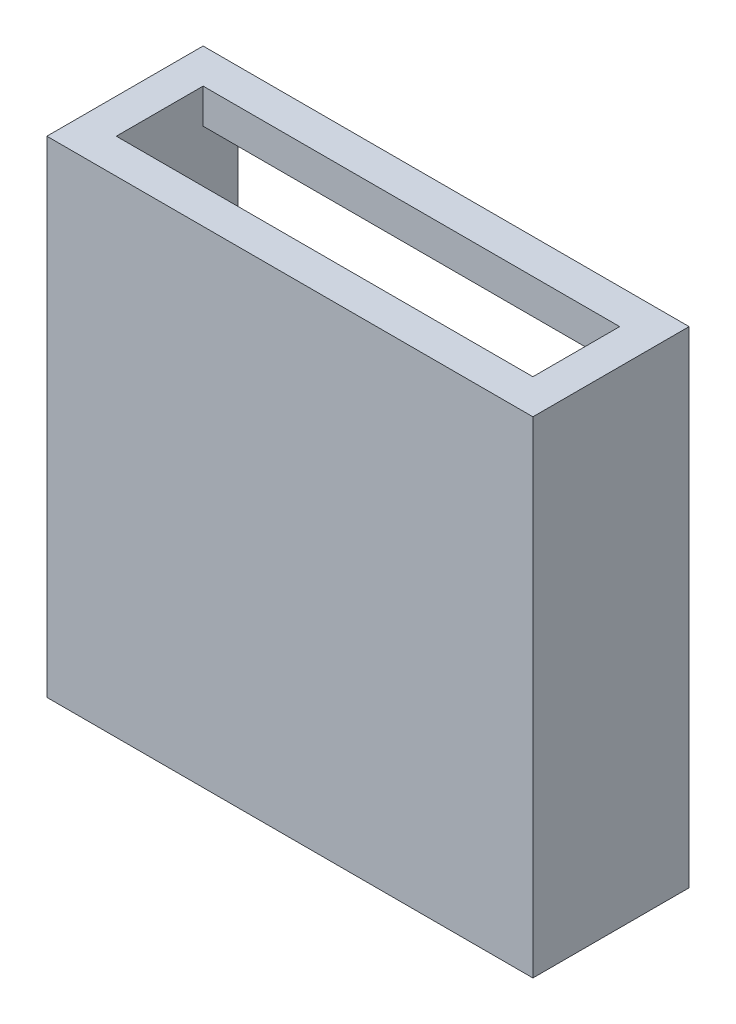
ISO-10303-21;
HEADER;
FILE_DESCRIPTION(('STEP AP214'),'2;1');
FILE_NAME('part.step','',(''),(''),'','','');
FILE_SCHEMA(('AUTOMOTIVE_DESIGN { 1 0 10303 214 1 1 1 1 }'));
ENDSEC;
DATA;
#1=APPLICATION_CONTEXT('core data for automotive mechanical design processes');
#2=APPLICATION_PROTOCOL_DEFINITION('international standard','automotive_design',2000,#1);
#3=PRODUCT_CONTEXT('',#1,'mechanical');
#4=PRODUCT('Part','Part','',(#3));
#5=PRODUCT_RELATED_PRODUCT_CATEGORY('part','',(#4));
#6=PRODUCT_DEFINITION_FORMATION('','',#4);
#7=PRODUCT_DEFINITION_CONTEXT('part definition',#1,'design');
#8=PRODUCT_DEFINITION('design','',#6,#7);
#9=PRODUCT_DEFINITION_SHAPE('','',#8);
#10=(LENGTH_UNIT() NAMED_UNIT(*) SI_UNIT(.MILLI.,.METRE.));
#11=(NAMED_UNIT(*) PLANE_ANGLE_UNIT() SI_UNIT($,.RADIAN.));
#12=(NAMED_UNIT(*) SI_UNIT($,.STERADIAN.) SOLID_ANGLE_UNIT());
#13=UNCERTAINTY_MEASURE_WITH_UNIT(LENGTH_MEASURE(1.E-05),#10,'distance_accuracy_value','');
#14=(GEOMETRIC_REPRESENTATION_CONTEXT(3) GLOBAL_UNCERTAINTY_ASSIGNED_CONTEXT((#13)) GLOBAL_UNIT_ASSIGNED_CONTEXT((#10,
#11,#12)) REPRESENTATION_CONTEXT('',''));
#15=CARTESIAN_POINT('',(0.,0.,0.));
#16=DIRECTION('',(0.,0.,1.));
#17=DIRECTION('',(1.,0.,0.));
#18=AXIS2_PLACEMENT_3D('',#15,#16,#17);
#19=CARTESIAN_POINT('',(12.,-12.,-7.));
#20=DIRECTION('',(-1.,0.,0.));
#21=DIRECTION('',(0.,-1.,0.));
#22=AXIS2_PLACEMENT_3D('',#19,#20,#21);
#23=PLANE('',#22);
#24=DIRECTION('',(0.,0.,1.));
#25=VECTOR('',#24,1.);
#26=CARTESIAN_POINT('',(12.,-12.,-7.));
#27=LINE('',#26,#25);
#28=CARTESIAN_POINT('',(12.,-12.,-7.));
#29=VERTEX_POINT('',#28);
#30=CARTESIAN_POINT('',(12.,-12.,-5.));
#31=VERTEX_POINT('',#30);
#32=EDGE_CURVE('E384',#29,#31,#27,.T.);
#33=ORIENTED_EDGE('',*,*,#32,.T.);
#34=DIRECTION('',(0.,1.,0.));
#35=VECTOR('',#34,1.);
#36=CARTESIAN_POINT('',(12.,-14.,-5.));
#37=LINE('',#36,#35);
#38=CARTESIAN_POINT('',(12.,-14.,-5.));
#39=VERTEX_POINT('',#38);
#40=EDGE_CURVE('E365',#39,#31,#37,.T.);
#41=ORIENTED_EDGE('',*,*,#40,.F.);
#42=DIRECTION('',(0.,0.,-1.));
#43=VECTOR('',#42,1.);
#44=CARTESIAN_POINT('',(12.,-14.,0.));
#45=LINE('',#44,#43);
#46=CARTESIAN_POINT('',(12.,-14.,0.));
#47=VERTEX_POINT('',#46);
#48=EDGE_CURVE('E343',#47,#39,#45,.T.);
#49=ORIENTED_EDGE('',*,*,#48,.F.);
#50=DIRECTION('',(0.,-1.,0.));
#51=VECTOR('',#50,1.);
#52=CARTESIAN_POINT('',(12.,-12.,0.));
#53=LINE('',#52,#51);
#54=CARTESIAN_POINT('',(12.,14.,0.));
#55=VERTEX_POINT('',#54);
#56=EDGE_CURVE('E372',#55,#47,#53,.T.);
#57=ORIENTED_EDGE('',*,*,#56,.F.);
#58=DIRECTION('',(0.,0.,-1.));
#59=VECTOR('',#58,1.);
#60=CARTESIAN_POINT('',(12.,14.,0.));
#61=LINE('',#60,#59);
#62=CARTESIAN_POINT('',(12.,14.,-5.));
#63=VERTEX_POINT('',#62);
#64=EDGE_CURVE('E355',#55,#63,#61,.T.);
#65=ORIENTED_EDGE('',*,*,#64,.T.);
#66=CARTESIAN_POINT('',(12.,12.,-5.));
#67=VERTEX_POINT('',#66);
#68=EDGE_CURVE('E349',#67,#63,#37,.T.);
#69=ORIENTED_EDGE('',*,*,#68,.F.);
#70=DIRECTION('',(0.,0.,1.));
#71=VECTOR('',#70,1.);
#72=CARTESIAN_POINT('',(12.,12.,-7.));
#73=LINE('',#72,#71);
#74=CARTESIAN_POINT('',(12.,12.,-7.));
#75=VERTEX_POINT('',#74);
#76=EDGE_CURVE('E387',#75,#67,#73,.T.);
#77=ORIENTED_EDGE('',*,*,#76,.F.);
#78=DIRECTION('',(0.,-1.,0.));
#79=VECTOR('',#78,1.);
#80=CARTESIAN_POINT('',(12.,-12.,-7.));
#81=LINE('',#80,#79);
#82=EDGE_CURVE('E374',#75,#29,#81,.T.);
#83=ORIENTED_EDGE('',*,*,#82,.T.);
#84=EDGE_LOOP('',(#33,#41,#49,#57,#65,#69,#77,#83));
#85=FACE_BOUND('',#84,.T.);
#86=DIRECTION('',(0.,1.,0.));
#87=VECTOR('',#86,1.);
#88=CARTESIAN_POINT('',(12.,-4.,-4.));
#89=LINE('',#88,#87);
#90=CARTESIAN_POINT('',(12.,-4.,-4.));
#91=VERTEX_POINT('',#90);
#92=CARTESIAN_POINT('',(12.,4.,-4.));
#93=VERTEX_POINT('',#92);
#94=EDGE_CURVE('E53',#91,#93,#89,.T.);
#95=ORIENTED_EDGE('',*,*,#94,.F.);
#96=DIRECTION('',(0.,0.,1.));
#97=VECTOR('',#96,1.);
#98=CARTESIAN_POINT('',(12.,-4.,-4.));
#99=LINE('',#98,#97);
#100=CARTESIAN_POINT('',(12.,-4.,-6.));
#101=VERTEX_POINT('',#100);
#102=EDGE_CURVE('E58',#101,#91,#99,.T.);
#103=ORIENTED_EDGE('',*,*,#102,.F.);
#104=DIRECTION('',(0.,1.,0.));
#105=VECTOR('',#104,1.);
#106=CARTESIAN_POINT('',(12.,-4.,-6.));
#107=LINE('',#106,#105);
#108=CARTESIAN_POINT('',(12.,4.,-6.));
#109=VERTEX_POINT('',#108);
#110=EDGE_CURVE('E213',#101,#109,#107,.T.);
#111=ORIENTED_EDGE('',*,*,#110,.T.);
#112=DIRECTION('',(0.,0.,1.));
#113=VECTOR('',#112,1.);
#114=CARTESIAN_POINT('',(12.,4.,-4.));
#115=LINE('',#114,#113);
#116=EDGE_CURVE('E215',#109,#93,#115,.T.);
#117=ORIENTED_EDGE('',*,*,#116,.T.);
#118=EDGE_LOOP('',(#95,#103,#111,#117));
#119=FACE_BOUND('',#118,.T.);
#120=ADVANCED_FACE('F38',(#85,#119),#23,.T.);
#121=CARTESIAN_POINT('',(-12.,-12.,-7.));
#122=DIRECTION('',(1.,0.,0.));
#123=DIRECTION('',(0.,0.,-1.));
#124=AXIS2_PLACEMENT_3D('',#121,#122,#123);
#125=PLANE('',#124);
#126=DIRECTION('',(0.,0.,1.));
#127=VECTOR('',#126,1.);
#128=CARTESIAN_POINT('',(-12.,12.,-7.));
#129=LINE('',#128,#127);
#130=CARTESIAN_POINT('',(-12.,12.,-7.));
#131=VERTEX_POINT('',#130);
#132=CARTESIAN_POINT('',(-12.,12.,-5.));
#133=VERTEX_POINT('',#132);
#134=EDGE_CURVE('E390',#131,#133,#129,.T.);
#135=ORIENTED_EDGE('',*,*,#134,.T.);
#136=DIRECTION('',(0.,1.,0.));
#137=VECTOR('',#136,1.);
#138=CARTESIAN_POINT('',(-12.,-14.,-5.));
#139=LINE('',#138,#137);
#140=CARTESIAN_POINT('',(-12.,14.,-5.));
#141=VERTEX_POINT('',#140);
#142=EDGE_CURVE('E364',#133,#141,#139,.T.);
#143=ORIENTED_EDGE('',*,*,#142,.T.);
#144=DIRECTION('',(0.,0.,1.));
#145=VECTOR('',#144,1.);
#146=CARTESIAN_POINT('',(-12.,14.,0.));
#147=LINE('',#146,#145);
#148=CARTESIAN_POINT('',(-12.,14.,0.));
#149=VERTEX_POINT('',#148);
#150=EDGE_CURVE('E335',#141,#149,#147,.T.);
#151=ORIENTED_EDGE('',*,*,#150,.T.);
#152=DIRECTION('',(0.,1.,0.));
#153=VECTOR('',#152,1.);
#154=CARTESIAN_POINT('',(-12.,-12.,0.));
#155=LINE('',#154,#153);
#156=CARTESIAN_POINT('',(-12.,-14.,0.));
#157=VERTEX_POINT('',#156);
#158=EDGE_CURVE('E368',#157,#149,#155,.T.);
#159=ORIENTED_EDGE('',*,*,#158,.F.);
#160=DIRECTION('',(0.,0.,1.));
#161=VECTOR('',#160,1.);
#162=CARTESIAN_POINT('',(-12.,-14.,0.));
#163=LINE('',#162,#161);
#164=CARTESIAN_POINT('',(-12.,-14.,-5.));
#165=VERTEX_POINT('',#164);
#166=EDGE_CURVE('E336',#165,#157,#163,.T.);
#167=ORIENTED_EDGE('',*,*,#166,.F.);
#168=CARTESIAN_POINT('',(-12.,-12.,-5.));
#169=VERTEX_POINT('',#168);
#170=EDGE_CURVE('E360',#165,#169,#139,.T.);
#171=ORIENTED_EDGE('',*,*,#170,.T.);
#172=DIRECTION('',(0.,0.,1.));
#173=VECTOR('',#172,1.);
#174=CARTESIAN_POINT('',(-12.,-12.,-7.));
#175=LINE('',#174,#173);
#176=CARTESIAN_POINT('',(-12.,-12.,-7.));
#177=VERTEX_POINT('',#176);
#178=EDGE_CURVE('E379',#177,#169,#175,.T.);
#179=ORIENTED_EDGE('',*,*,#178,.F.);
#180=DIRECTION('',(0.,1.,0.));
#181=VECTOR('',#180,1.);
#182=CARTESIAN_POINT('',(-12.,-12.,-7.));
#183=LINE('',#182,#181);
#184=EDGE_CURVE('E369',#177,#131,#183,.T.);
#185=ORIENTED_EDGE('',*,*,#184,.T.);
#186=EDGE_LOOP('',(#135,#143,#151,#159,#167,#171,#179,#185));
#187=FACE_BOUND('',#186,.T.);
#188=DIRECTION('',(0.,1.,0.));
#189=VECTOR('',#188,1.);
#190=CARTESIAN_POINT('',(-12.,-4.,-6.));
#191=LINE('',#190,#189);
#192=CARTESIAN_POINT('',(-12.,-4.,-6.));
#193=VERTEX_POINT('',#192);
#194=CARTESIAN_POINT('',(-12.,4.,-6.));
#195=VERTEX_POINT('',#194);
#196=EDGE_CURVE('E259',#193,#195,#191,.T.);
#197=ORIENTED_EDGE('',*,*,#196,.F.);
#198=DIRECTION('',(0.,0.,1.));
#199=VECTOR('',#198,1.);
#200=CARTESIAN_POINT('',(-12.,-4.,-4.));
#201=LINE('',#200,#199);
#202=CARTESIAN_POINT('',(-12.,-4.,-4.));
#203=VERTEX_POINT('',#202);
#204=EDGE_CURVE('E250',#193,#203,#201,.T.);
#205=ORIENTED_EDGE('',*,*,#204,.T.);
#206=DIRECTION('',(0.,1.,0.));
#207=VECTOR('',#206,1.);
#208=CARTESIAN_POINT('',(-12.,-4.,-4.));
#209=LINE('',#208,#207);
#210=CARTESIAN_POINT('',(-12.,4.,-4.));
#211=VERTEX_POINT('',#210);
#212=EDGE_CURVE('E258',#203,#211,#209,.T.);
#213=ORIENTED_EDGE('',*,*,#212,.T.);
#214=DIRECTION('',(0.,0.,1.));
#215=VECTOR('',#214,1.);
#216=CARTESIAN_POINT('',(-12.,4.,-4.));
#217=LINE('',#216,#215);
#218=EDGE_CURVE('E240',#195,#211,#217,.T.);
#219=ORIENTED_EDGE('',*,*,#218,.F.);
#220=EDGE_LOOP('',(#197,#205,#213,#219));
#221=FACE_BOUND('',#220,.T.);
#222=ADVANCED_FACE('F454',(#187,#221),#125,.T.);
#223=CARTESIAN_POINT('',(0.,0.,0.));
#224=DIRECTION('',(0.,0.,1.));
#225=DIRECTION('',(1.,0.,0.));
#226=AXIS2_PLACEMENT_3D('',#223,#224,#225);
#227=PLANE('',#226);
#228=ORIENTED_EDGE('',*,*,#56,.T.);
#229=DIRECTION('',(1.,0.,0.));
#230=VECTOR('',#229,1.);
#231=CARTESIAN_POINT('',(12.,-14.,0.));
#232=LINE('',#231,#230);
#233=EDGE_CURVE('E339',#157,#47,#232,.T.);
#234=ORIENTED_EDGE('',*,*,#233,.F.);
#235=ORIENTED_EDGE('',*,*,#158,.T.);
#236=DIRECTION('',(1.,0.,0.));
#237=VECTOR('',#236,1.);
#238=CARTESIAN_POINT('',(12.,14.,0.));
#239=LINE('',#238,#237);
#240=EDGE_CURVE('E352',#149,#55,#239,.T.);
#241=ORIENTED_EDGE('',*,*,#240,.T.);
#242=EDGE_LOOP('',(#228,#234,#235,#241));
#243=FACE_BOUND('',#242,.T.);
#244=DIRECTION('',(0.866025403784439,0.5,0.));
#245=VECTOR('',#244,1.);
#246=CARTESIAN_POINT('',(-0.199999999999979,0.346410161513738,0.));
#247=LINE('',#246,#245);
#248=CARTESIAN_POINT('',(-2.36506350946114,-0.903589838486298,0.));
#249=VERTEX_POINT('',#248);
#250=CARTESIAN_POINT('',(-0.4,0.230940107675801,0.));
#251=VERTEX_POINT('',#250);
#252=EDGE_CURVE('E262',#249,#251,#247,.T.);
#253=ORIENTED_EDGE('',*,*,#252,.F.);
#254=DIRECTION('',(0.5,-0.866025403784439,0.));
#255=VECTOR('',#254,1.);
#256=CARTESIAN_POINT('',(-2.16506350946116,-1.25000000000004,0.));
#257=LINE('',#256,#255);
#258=CARTESIAN_POINT('',(-1.96506350946114,-1.59641016151385,0.));
#259=VERTEX_POINT('',#258);
#260=EDGE_CURVE('E269',#249,#259,#257,.T.);
#261=ORIENTED_EDGE('',*,*,#260,.T.);
#262=DIRECTION('',(0.866025403784439,0.5,0.));
#263=VECTOR('',#262,1.);
#264=CARTESIAN_POINT('',(0.200000000000022,-0.346410161513813,0.));
#265=LINE('',#264,#263);
#266=CARTESIAN_POINT('',(0.,-0.46188021535175,0.));
#267=VERTEX_POINT('',#266);
#268=EDGE_CURVE('E312',#259,#267,#265,.T.);
#269=ORIENTED_EDGE('',*,*,#268,.T.);
#270=DIRECTION('',(-0.866025403784438,0.500000000000001,0.));
#271=VECTOR('',#270,1.);
#272=CARTESIAN_POINT('',(-0.200000000000022,-0.346410161513812,0.));
#273=LINE('',#272,#271);
#274=CARTESIAN_POINT('',(1.96506350946114,-1.59641016151385,0.));
#275=VERTEX_POINT('',#274);
#276=EDGE_CURVE('E309',#275,#267,#273,.T.);
#277=ORIENTED_EDGE('',*,*,#276,.F.);
#278=DIRECTION('',(0.5,0.866025403784439,0.));
#279=VECTOR('',#278,1.);
#280=CARTESIAN_POINT('',(2.16506350946116,-1.25000000000004,0.));
#281=LINE('',#280,#279);
#282=CARTESIAN_POINT('',(2.36506350946114,-0.903589838486301,0.));
#283=VERTEX_POINT('',#282);
#284=EDGE_CURVE('E306',#275,#283,#281,.T.);
#285=ORIENTED_EDGE('',*,*,#284,.T.);
#286=DIRECTION('',(-0.866025403784438,0.500000000000001,0.));
#287=VECTOR('',#286,1.);
#288=CARTESIAN_POINT('',(0.199999999999979,0.346410161513738,0.));
#289=LINE('',#288,#287);
#290=CARTESIAN_POINT('',(0.4,0.230940107675801,0.));
#291=VERTEX_POINT('',#290);
#292=EDGE_CURVE('E303',#283,#291,#289,.T.);
#293=ORIENTED_EDGE('',*,*,#292,.T.);
#294=DIRECTION('',(0.,-1.,0.));
#295=VECTOR('',#294,1.);
#296=CARTESIAN_POINT('',(0.4,0.,0.));
#297=LINE('',#296,#295);
#298=CARTESIAN_POINT('',(0.4,2.5,0.));
#299=VERTEX_POINT('',#298);
#300=EDGE_CURVE('E300',#299,#291,#297,.T.);
#301=ORIENTED_EDGE('',*,*,#300,.F.);
#302=DIRECTION('',(-1.,0.,0.));
#303=VECTOR('',#302,1.);
#304=CARTESIAN_POINT('',(0.,2.5,0.));
#305=LINE('',#304,#303);
#306=CARTESIAN_POINT('',(-0.4,2.5,0.));
#307=VERTEX_POINT('',#306);
#308=EDGE_CURVE('E297',#299,#307,#305,.T.);
#309=ORIENTED_EDGE('',*,*,#308,.T.);
#310=DIRECTION('',(0.,-1.,0.));
#311=VECTOR('',#310,1.);
#312=CARTESIAN_POINT('',(-0.4,0.,0.));
#313=LINE('',#312,#311);
#314=EDGE_CURVE('E294',#307,#251,#313,.T.);
#315=ORIENTED_EDGE('',*,*,#314,.T.);
#316=EDGE_LOOP('',(#253,#261,#269,#277,#285,#293,#301,#309,#315));
#317=FACE_BOUND('',#316,.T.);
#318=ADVANCED_FACE('F460',(#243,#317),#227,.F.);
#319=CARTESIAN_POINT('',(14.,14.,2.));
#320=DIRECTION('',(-1.,0.,0.));
#321=DIRECTION('',(0.,-1.,0.));
#322=AXIS2_PLACEMENT_3D('',#319,#320,#321);
#323=PLANE('',#322);
#324=DIRECTION('',(0.,0.,-1.));
#325=VECTOR('',#324,1.);
#326=CARTESIAN_POINT('',(14.,-14.,2.));
#327=LINE('',#326,#325);
#328=CARTESIAN_POINT('',(14.,-14.,2.));
#329=VERTEX_POINT('',#328);
#330=CARTESIAN_POINT('',(14.,-14.,-7.));
#331=VERTEX_POINT('',#330);
#332=EDGE_CURVE('E414',#329,#331,#327,.T.);
#333=ORIENTED_EDGE('',*,*,#332,.T.);
#334=DIRECTION('',(0.,-1.,0.));
#335=VECTOR('',#334,1.);
#336=CARTESIAN_POINT('',(14.,-14.,-7.));
#337=LINE('',#336,#335);
#338=CARTESIAN_POINT('',(14.,14.,-7.));
#339=VERTEX_POINT('',#338);
#340=EDGE_CURVE('E393',#339,#331,#337,.T.);
#341=ORIENTED_EDGE('',*,*,#340,.F.);
#342=DIRECTION('',(0.,0.,-1.));
#343=VECTOR('',#342,1.);
#344=CARTESIAN_POINT('',(14.,14.,2.));
#345=LINE('',#344,#343);
#346=CARTESIAN_POINT('',(14.,14.,2.));
#347=VERTEX_POINT('',#346);
#348=EDGE_CURVE('E46',#347,#339,#345,.T.);
#349=ORIENTED_EDGE('',*,*,#348,.F.);
#350=DIRECTION('',(0.,1.,0.));
#351=VECTOR('',#350,1.);
#352=CARTESIAN_POINT('',(14.,14.,2.));
#353=LINE('',#352,#351);
#354=EDGE_CURVE('E405',#329,#347,#353,.T.);
#355=ORIENTED_EDGE('',*,*,#354,.F.);
#356=EDGE_LOOP('',(#333,#341,#349,#355));
#357=FACE_BOUND('',#356,.T.);
#358=ADVANCED_FACE('F40',(#357),#323,.F.);
#359=CARTESIAN_POINT('',(-14.,14.,2.));
#360=DIRECTION('',(0.,-1.,0.));
#361=DIRECTION('',(0.,0.,-1.));
#362=AXIS2_PLACEMENT_3D('',#359,#360,#361);
#363=PLANE('',#362);
#364=ORIENTED_EDGE('',*,*,#240,.F.);
#365=ORIENTED_EDGE('',*,*,#150,.F.);
#366=DIRECTION('',(-1.,0.,0.));
#367=VECTOR('',#366,1.);
#368=CARTESIAN_POINT('',(12.,14.,-5.));
#369=LINE('',#368,#367);
#370=EDGE_CURVE('E340',#63,#141,#369,.T.);
#371=ORIENTED_EDGE('',*,*,#370,.F.);
#372=ORIENTED_EDGE('',*,*,#64,.F.);
#373=EDGE_LOOP('',(#364,#365,#371,#372));
#374=FACE_BOUND('',#373,.T.);
#375=ORIENTED_EDGE('',*,*,#348,.T.);
#376=DIRECTION('',(1.,0.,0.));
#377=VECTOR('',#376,1.);
#378=CARTESIAN_POINT('',(-14.,14.,-7.));
#379=LINE('',#378,#377);
#380=CARTESIAN_POINT('',(-14.,14.,-7.));
#381=VERTEX_POINT('',#380);
#382=EDGE_CURVE('E402',#381,#339,#379,.T.);
#383=ORIENTED_EDGE('',*,*,#382,.F.);
#384=DIRECTION('',(0.,0.,-1.));
#385=VECTOR('',#384,1.);
#386=CARTESIAN_POINT('',(-14.,14.,2.));
#387=LINE('',#386,#385);
#388=CARTESIAN_POINT('',(-14.,14.,2.));
#389=VERTEX_POINT('',#388);
#390=EDGE_CURVE('E418',#389,#381,#387,.T.);
#391=ORIENTED_EDGE('',*,*,#390,.F.);
#392=DIRECTION('',(-1.,0.,0.));
#393=VECTOR('',#392,1.);
#394=CARTESIAN_POINT('',(-14.,14.,2.));
#395=LINE('',#394,#393);
#396=EDGE_CURVE('E408',#347,#389,#395,.T.);
#397=ORIENTED_EDGE('',*,*,#396,.F.);
#398=EDGE_LOOP('',(#375,#383,#391,#397));
#399=FACE_BOUND('',#398,.T.);
#400=ADVANCED_FACE('F422',(#374,#399),#363,.F.);
#401=CARTESIAN_POINT('',(-14.,14.,2.));
#402=DIRECTION('',(1.,0.,0.));
#403=DIRECTION('',(0.,1.,0.));
#404=AXIS2_PLACEMENT_3D('',#401,#402,#403);
#405=PLANE('',#404);
#406=ORIENTED_EDGE('',*,*,#390,.T.);
#407=DIRECTION('',(0.,1.,0.));
#408=VECTOR('',#407,1.);
#409=CARTESIAN_POINT('',(-14.,-14.,-7.));
#410=LINE('',#409,#408);
#411=CARTESIAN_POINT('',(-14.,-14.,-7.));
#412=VERTEX_POINT('',#411);
#413=EDGE_CURVE('E399',#412,#381,#410,.T.);
#414=ORIENTED_EDGE('',*,*,#413,.F.);
#415=DIRECTION('',(0.,0.,-1.));
#416=VECTOR('',#415,1.);
#417=CARTESIAN_POINT('',(-14.,-14.,2.));
#418=LINE('',#417,#416);
#419=CARTESIAN_POINT('',(-14.,-14.,2.));
#420=VERTEX_POINT('',#419);
#421=EDGE_CURVE('E416',#420,#412,#418,.T.);
#422=ORIENTED_EDGE('',*,*,#421,.F.);
#423=DIRECTION('',(0.,-1.,0.));
#424=VECTOR('',#423,1.);
#425=CARTESIAN_POINT('',(-14.,14.,2.));
#426=LINE('',#425,#424);
#427=EDGE_CURVE('E410',#389,#420,#426,.T.);
#428=ORIENTED_EDGE('',*,*,#427,.F.);
#429=EDGE_LOOP('',(#406,#414,#422,#428));
#430=FACE_BOUND('',#429,.T.);
#431=ADVANCED_FACE('F438',(#430),#405,.F.);
#432=CARTESIAN_POINT('',(-14.,-14.,2.));
#433=DIRECTION('',(0.,1.,0.));
#434=DIRECTION('',(0.,0.,1.));
#435=AXIS2_PLACEMENT_3D('',#432,#433,#434);
#436=PLANE('',#435);
#437=DIRECTION('',(-1.,0.,0.));
#438=VECTOR('',#437,1.);
#439=CARTESIAN_POINT('',(12.,-14.,-5.));
#440=LINE('',#439,#438);
#441=EDGE_CURVE('E346',#39,#165,#440,.T.);
#442=ORIENTED_EDGE('',*,*,#441,.T.);
#443=ORIENTED_EDGE('',*,*,#166,.T.);
#444=ORIENTED_EDGE('',*,*,#233,.T.);
#445=ORIENTED_EDGE('',*,*,#48,.T.);
#446=EDGE_LOOP('',(#442,#443,#444,#445));
#447=FACE_BOUND('',#446,.T.);
#448=ORIENTED_EDGE('',*,*,#421,.T.);
#449=DIRECTION('',(-1.,0.,0.));
#450=VECTOR('',#449,1.);
#451=CARTESIAN_POINT('',(-14.,-14.,-7.));
#452=LINE('',#451,#450);
#453=EDGE_CURVE('E396',#331,#412,#452,.T.);
#454=ORIENTED_EDGE('',*,*,#453,.F.);
#455=ORIENTED_EDGE('',*,*,#332,.F.);
#456=DIRECTION('',(1.,0.,0.));
#457=VECTOR('',#456,1.);
#458=CARTESIAN_POINT('',(-14.,-14.,2.));
#459=LINE('',#458,#457);
#460=EDGE_CURVE('E412',#420,#329,#459,.T.);
#461=ORIENTED_EDGE('',*,*,#460,.F.);
#462=EDGE_LOOP('',(#448,#454,#455,#461));
#463=FACE_BOUND('',#462,.T.);
#464=ADVANCED_FACE('F435',(#447,#463),#436,.F.);
#465=CARTESIAN_POINT('',(0.,0.,2.));
#466=DIRECTION('',(0.,0.,1.));
#467=DIRECTION('',(1.,0.,0.));
#468=AXIS2_PLACEMENT_3D('',#465,#466,#467);
#469=PLANE('',#468);
#470=ORIENTED_EDGE('',*,*,#354,.T.);
#471=ORIENTED_EDGE('',*,*,#396,.T.);
#472=ORIENTED_EDGE('',*,*,#427,.T.);
#473=ORIENTED_EDGE('',*,*,#460,.T.);
#474=EDGE_LOOP('',(#470,#471,#472,#473));
#475=FACE_BOUND('',#474,.T.);
#476=ADVANCED_FACE('F441',(#475),#469,.T.);
#477=CARTESIAN_POINT('',(0.,0.,-7.));
#478=DIRECTION('',(0.,0.,-1.));
#479=DIRECTION('',(-1.,0.,0.));
#480=AXIS2_PLACEMENT_3D('',#477,#478,#479);
#481=PLANE('',#480);
#482=ORIENTED_EDGE('',*,*,#340,.T.);
#483=ORIENTED_EDGE('',*,*,#453,.T.);
#484=ORIENTED_EDGE('',*,*,#413,.T.);
#485=ORIENTED_EDGE('',*,*,#382,.T.);
#486=EDGE_LOOP('',(#482,#483,#484,#485));
#487=FACE_BOUND('',#486,.T.);
#488=DIRECTION('',(1.,0.,0.));
#489=VECTOR('',#488,1.);
#490=CARTESIAN_POINT('',(-12.,12.,-7.));
#491=LINE('',#490,#489);
#492=EDGE_CURVE('E371',#131,#75,#491,.T.);
#493=ORIENTED_EDGE('',*,*,#492,.F.);
#494=ORIENTED_EDGE('',*,*,#184,.F.);
#495=DIRECTION('',(-1.,0.,0.));
#496=VECTOR('',#495,1.);
#497=CARTESIAN_POINT('',(-12.,-12.,-7.));
#498=LINE('',#497,#496);
#499=EDGE_CURVE('E377',#29,#177,#498,.T.);
#500=ORIENTED_EDGE('',*,*,#499,.F.);
#501=ORIENTED_EDGE('',*,*,#82,.F.);
#502=EDGE_LOOP('',(#493,#494,#500,#501));
#503=FACE_BOUND('',#502,.T.);
#504=ADVANCED_FACE('F428',(#487,#503),#481,.T.);
#505=CARTESIAN_POINT('',(-12.,12.,-7.));
#506=DIRECTION('',(0.,-1.,0.));
#507=DIRECTION('',(1.,0.,0.));
#508=AXIS2_PLACEMENT_3D('',#505,#506,#507);
#509=PLANE('',#508);
#510=DIRECTION('',(1.,0.,0.));
#511=VECTOR('',#510,1.);
#512=CARTESIAN_POINT('',(-12.,12.,-5.));
#513=LINE('',#512,#511);
#514=EDGE_CURVE('E363',#133,#67,#513,.T.);
#515=ORIENTED_EDGE('',*,*,#514,.F.);
#516=ORIENTED_EDGE('',*,*,#134,.F.);
#517=ORIENTED_EDGE('',*,*,#492,.T.);
#518=ORIENTED_EDGE('',*,*,#76,.T.);
#519=EDGE_LOOP('',(#515,#516,#517,#518));
#520=FACE_BOUND('',#519,.T.);
#521=ADVANCED_FACE('F448',(#520),#509,.T.);
#522=CARTESIAN_POINT('',(-12.,-12.,-7.));
#523=DIRECTION('',(0.,1.,0.));
#524=DIRECTION('',(0.,0.,1.));
#525=AXIS2_PLACEMENT_3D('',#522,#523,#524);
#526=PLANE('',#525);
#527=DIRECTION('',(-1.,0.,0.));
#528=VECTOR('',#527,1.);
#529=CARTESIAN_POINT('',(-12.,-12.,-5.));
#530=LINE('',#529,#528);
#531=EDGE_CURVE('E11',#31,#169,#530,.T.);
#532=ORIENTED_EDGE('',*,*,#531,.F.);
#533=ORIENTED_EDGE('',*,*,#32,.F.);
#534=ORIENTED_EDGE('',*,*,#499,.T.);
#535=ORIENTED_EDGE('',*,*,#178,.T.);
#536=EDGE_LOOP('',(#532,#533,#534,#535));
#537=FACE_BOUND('',#536,.T.);
#538=ADVANCED_FACE('F465',(#537),#526,.T.);
#539=CARTESIAN_POINT('',(12.,-14.,-5.));
#540=DIRECTION('',(0.,0.,-1.));
#541=DIRECTION('',(-1.,0.,0.));
#542=AXIS2_PLACEMENT_3D('',#539,#540,#541);
#543=PLANE('',#542);
#544=ORIENTED_EDGE('',*,*,#531,.T.);
#545=ORIENTED_EDGE('',*,*,#170,.F.);
#546=ORIENTED_EDGE('',*,*,#441,.F.);
#547=ORIENTED_EDGE('',*,*,#40,.T.);
#548=EDGE_LOOP('',(#544,#545,#546,#547));
#549=FACE_BOUND('',#548,.T.);
#550=ADVANCED_FACE('F472',(#549),#543,.F.);
#551=ORIENTED_EDGE('',*,*,#514,.T.);
#552=ORIENTED_EDGE('',*,*,#68,.T.);
#553=ORIENTED_EDGE('',*,*,#370,.T.);
#554=ORIENTED_EDGE('',*,*,#142,.F.);
#555=EDGE_LOOP('',(#551,#552,#553,#554));
#556=FACE_BOUND('',#555,.T.);
#557=ADVANCED_FACE('F487',(#556),#543,.F.);
#558=CARTESIAN_POINT('',(-0.199999999999979,0.346410161513738,-3.5));
#559=DIRECTION('',(0.5,-0.866025403784439,0.));
#560=DIRECTION('',(0.866025403784439,0.5,0.));
#561=AXIS2_PLACEMENT_3D('',#558,#559,#560);
#562=PLANE('',#561);
#563=ORIENTED_EDGE('',*,*,#252,.T.);
#564=DIRECTION('',(0.,0.,1.));
#565=VECTOR('',#564,1.);
#566=CARTESIAN_POINT('',(-0.4,0.230940107675801,-3.5));
#567=LINE('',#566,#565);
#568=CARTESIAN_POINT('',(-0.4,0.230940107675801,-3.5));
#569=VERTEX_POINT('',#568);
#570=EDGE_CURVE('E333',#569,#251,#567,.T.);
#571=ORIENTED_EDGE('',*,*,#570,.F.);
#572=DIRECTION('',(0.866025403784439,0.5,0.));
#573=VECTOR('',#572,1.);
#574=CARTESIAN_POINT('',(-0.199999999999979,0.346410161513738,-3.5));
#575=LINE('',#574,#573);
#576=CARTESIAN_POINT('',(-2.36506350946114,-0.903589838486298,-3.5));
#577=VERTEX_POINT('',#576);
#578=EDGE_CURVE('E266',#577,#569,#575,.T.);
#579=ORIENTED_EDGE('',*,*,#578,.F.);
#580=DIRECTION('',(0.,0.,1.));
#581=VECTOR('',#580,1.);
#582=CARTESIAN_POINT('',(-2.36506350946114,-0.903589838486298,-3.5));
#583=LINE('',#582,#581);
#584=EDGE_CURVE('E291',#577,#249,#583,.T.);
#585=ORIENTED_EDGE('',*,*,#584,.T.);
#586=EDGE_LOOP('',(#563,#571,#579,#585));
#587=FACE_BOUND('',#586,.T.);
#588=ADVANCED_FACE('F503',(#587),#562,.F.);
#589=CARTESIAN_POINT('',(-0.4,0.,-3.5));
#590=DIRECTION('',(-1.,0.,0.));
#591=DIRECTION('',(0.,-1.,0.));
#592=AXIS2_PLACEMENT_3D('',#589,#590,#591);
#593=PLANE('',#592);
#594=ORIENTED_EDGE('',*,*,#314,.F.);
#595=DIRECTION('',(0.,0.,1.));
#596=VECTOR('',#595,1.);
#597=CARTESIAN_POINT('',(-0.4,2.5,-3.5));
#598=LINE('',#597,#596);
#599=CARTESIAN_POINT('',(-0.4,2.5,-3.5));
#600=VERTEX_POINT('',#599);
#601=EDGE_CURVE('E331',#600,#307,#598,.T.);
#602=ORIENTED_EDGE('',*,*,#601,.F.);
#603=DIRECTION('',(0.,-1.,0.));
#604=VECTOR('',#603,1.);
#605=CARTESIAN_POINT('',(-0.4,0.,-3.5));
#606=LINE('',#605,#604);
#607=EDGE_CURVE('E268',#600,#569,#606,.T.);
#608=ORIENTED_EDGE('',*,*,#607,.T.);
#609=ORIENTED_EDGE('',*,*,#570,.T.);
#610=EDGE_LOOP('',(#594,#602,#608,#609));
#611=FACE_BOUND('',#610,.T.);
#612=ADVANCED_FACE('F507',(#611),#593,.T.);
#613=CARTESIAN_POINT('',(0.,2.5,-3.5));
#614=DIRECTION('',(0.,1.,0.));
#615=DIRECTION('',(0.,0.,1.));
#616=AXIS2_PLACEMENT_3D('',#613,#614,#615);
#617=PLANE('',#616);
#618=ORIENTED_EDGE('',*,*,#308,.F.);
#619=DIRECTION('',(0.,0.,1.));
#620=VECTOR('',#619,1.);
#621=CARTESIAN_POINT('',(0.4,2.5,-3.5));
#622=LINE('',#621,#620);
#623=CARTESIAN_POINT('',(0.4,2.5,-3.5));
#624=VERTEX_POINT('',#623);
#625=EDGE_CURVE('E329',#624,#299,#622,.T.);
#626=ORIENTED_EDGE('',*,*,#625,.F.);
#627=DIRECTION('',(-1.,0.,0.));
#628=VECTOR('',#627,1.);
#629=CARTESIAN_POINT('',(0.,2.5,-3.5));
#630=LINE('',#629,#628);
#631=EDGE_CURVE('E272',#624,#600,#630,.T.);
#632=ORIENTED_EDGE('',*,*,#631,.T.);
#633=ORIENTED_EDGE('',*,*,#601,.T.);
#634=EDGE_LOOP('',(#618,#626,#632,#633));
#635=FACE_BOUND('',#634,.T.);
#636=ADVANCED_FACE('F511',(#635),#617,.T.);
#637=CARTESIAN_POINT('',(0.4,0.,-3.5));
#638=DIRECTION('',(-1.,0.,0.));
#639=DIRECTION('',(0.,-1.,0.));
#640=AXIS2_PLACEMENT_3D('',#637,#638,#639);
#641=PLANE('',#640);
#642=ORIENTED_EDGE('',*,*,#300,.T.);
#643=DIRECTION('',(0.,0.,1.));
#644=VECTOR('',#643,1.);
#645=CARTESIAN_POINT('',(0.4,0.230940107675801,-3.5));
#646=LINE('',#645,#644);
#647=CARTESIAN_POINT('',(0.4,0.230940107675801,-3.5));
#648=VERTEX_POINT('',#647);
#649=EDGE_CURVE('E327',#648,#291,#646,.T.);
#650=ORIENTED_EDGE('',*,*,#649,.F.);
#651=DIRECTION('',(0.,-1.,0.));
#652=VECTOR('',#651,1.);
#653=CARTESIAN_POINT('',(0.4,0.,-3.5));
#654=LINE('',#653,#652);
#655=EDGE_CURVE('E275',#624,#648,#654,.T.);
#656=ORIENTED_EDGE('',*,*,#655,.F.);
#657=ORIENTED_EDGE('',*,*,#625,.T.);
#658=EDGE_LOOP('',(#642,#650,#656,#657));
#659=FACE_BOUND('',#658,.T.);
#660=ADVANCED_FACE('F515',(#659),#641,.F.);
#661=CARTESIAN_POINT('',(0.199999999999979,0.346410161513738,-3.5));
#662=DIRECTION('',(0.500000000000001,0.866025403784438,0.));
#663=DIRECTION('',(-0.866025403784438,0.500000000000001,0.));
#664=AXIS2_PLACEMENT_3D('',#661,#662,#663);
#665=PLANE('',#664);
#666=ORIENTED_EDGE('',*,*,#292,.F.);
#667=DIRECTION('',(0.,0.,1.));
#668=VECTOR('',#667,1.);
#669=CARTESIAN_POINT('',(2.36506350946114,-0.903589838486301,-3.5));
#670=LINE('',#669,#668);
#671=CARTESIAN_POINT('',(2.36506350946114,-0.903589838486301,-3.5));
#672=VERTEX_POINT('',#671);
#673=EDGE_CURVE('E325',#672,#283,#670,.T.);
#674=ORIENTED_EDGE('',*,*,#673,.F.);
#675=DIRECTION('',(-0.866025403784438,0.500000000000001,0.));
#676=VECTOR('',#675,1.);
#677=CARTESIAN_POINT('',(0.199999999999979,0.346410161513738,-3.5));
#678=LINE('',#677,#676);
#679=EDGE_CURVE('E277',#672,#648,#678,.T.);
#680=ORIENTED_EDGE('',*,*,#679,.T.);
#681=ORIENTED_EDGE('',*,*,#649,.T.);
#682=EDGE_LOOP('',(#666,#674,#680,#681));
#683=FACE_BOUND('',#682,.T.);
#684=ADVANCED_FACE('F519',(#683),#665,.T.);
#685=CARTESIAN_POINT('',(2.16506350946116,-1.25000000000004,-3.5));
#686=DIRECTION('',(0.866025403784438,-0.5,0.));
#687=DIRECTION('',(0.5,0.866025403784439,0.));
#688=AXIS2_PLACEMENT_3D('',#685,#686,#687);
#689=PLANE('',#688);
#690=ORIENTED_EDGE('',*,*,#284,.F.);
#691=DIRECTION('',(0.,0.,1.));
#692=VECTOR('',#691,1.);
#693=CARTESIAN_POINT('',(1.96506350946114,-1.59641016151385,-3.5));
#694=LINE('',#693,#692);
#695=CARTESIAN_POINT('',(1.96506350946114,-1.59641016151385,-3.5));
#696=VERTEX_POINT('',#695);
#697=EDGE_CURVE('E323',#696,#275,#694,.T.);
#698=ORIENTED_EDGE('',*,*,#697,.F.);
#699=DIRECTION('',(0.5,0.866025403784439,0.));
#700=VECTOR('',#699,1.);
#701=CARTESIAN_POINT('',(2.16506350946116,-1.25000000000004,-3.5));
#702=LINE('',#701,#700);
#703=EDGE_CURVE('E280',#696,#672,#702,.T.);
#704=ORIENTED_EDGE('',*,*,#703,.T.);
#705=ORIENTED_EDGE('',*,*,#673,.T.);
#706=EDGE_LOOP('',(#690,#698,#704,#705));
#707=FACE_BOUND('',#706,.T.);
#708=ADVANCED_FACE('F523',(#707),#689,.T.);
#709=CARTESIAN_POINT('',(-0.200000000000022,-0.346410161513812,-3.5));
#710=DIRECTION('',(0.500000000000001,0.866025403784438,0.));
#711=DIRECTION('',(-0.866025403784438,0.500000000000001,0.));
#712=AXIS2_PLACEMENT_3D('',#709,#710,#711);
#713=PLANE('',#712);
#714=ORIENTED_EDGE('',*,*,#276,.T.);
#715=DIRECTION('',(0.,0.,1.));
#716=VECTOR('',#715,1.);
#717=CARTESIAN_POINT('',(0.,-0.46188021535175,-3.5));
#718=LINE('',#717,#716);
#719=CARTESIAN_POINT('',(0.,-0.46188021535175,-3.5));
#720=VERTEX_POINT('',#719);
#721=EDGE_CURVE('E321',#720,#267,#718,.T.);
#722=ORIENTED_EDGE('',*,*,#721,.F.);
#723=DIRECTION('',(-0.866025403784438,0.500000000000001,0.));
#724=VECTOR('',#723,1.);
#725=CARTESIAN_POINT('',(-0.200000000000022,-0.346410161513812,-3.5));
#726=LINE('',#725,#724);
#727=EDGE_CURVE('E283',#696,#720,#726,.T.);
#728=ORIENTED_EDGE('',*,*,#727,.F.);
#729=ORIENTED_EDGE('',*,*,#697,.T.);
#730=EDGE_LOOP('',(#714,#722,#728,#729));
#731=FACE_BOUND('',#730,.T.);
#732=ADVANCED_FACE('F527',(#731),#713,.F.);
#733=CARTESIAN_POINT('',(0.200000000000022,-0.346410161513813,-3.5));
#734=DIRECTION('',(0.5,-0.866025403784439,0.));
#735=DIRECTION('',(0.866025403784439,0.5,0.));
#736=AXIS2_PLACEMENT_3D('',#733,#734,#735);
#737=PLANE('',#736);
#738=ORIENTED_EDGE('',*,*,#268,.F.);
#739=DIRECTION('',(0.,0.,1.));
#740=VECTOR('',#739,1.);
#741=CARTESIAN_POINT('',(-1.96506350946114,-1.59641016151385,-3.5));
#742=LINE('',#741,#740);
#743=CARTESIAN_POINT('',(-1.96506350946114,-1.59641016151385,-3.5));
#744=VERTEX_POINT('',#743);
#745=EDGE_CURVE('E318',#744,#259,#742,.T.);
#746=ORIENTED_EDGE('',*,*,#745,.F.);
#747=DIRECTION('',(0.866025403784439,0.5,0.));
#748=VECTOR('',#747,1.);
#749=CARTESIAN_POINT('',(0.200000000000022,-0.346410161513813,-3.5));
#750=LINE('',#749,#748);
#751=EDGE_CURVE('E285',#744,#720,#750,.T.);
#752=ORIENTED_EDGE('',*,*,#751,.T.);
#753=ORIENTED_EDGE('',*,*,#721,.T.);
#754=EDGE_LOOP('',(#738,#746,#752,#753));
#755=FACE_BOUND('',#754,.T.);
#756=ADVANCED_FACE('F531',(#755),#737,.T.);
#757=CARTESIAN_POINT('',(-2.16506350946116,-1.25000000000004,-3.5));
#758=DIRECTION('',(-0.866025403784439,-0.5,0.));
#759=DIRECTION('',(0.5,-0.866025403784439,0.));
#760=AXIS2_PLACEMENT_3D('',#757,#758,#759);
#761=PLANE('',#760);
#762=ORIENTED_EDGE('',*,*,#260,.F.);
#763=ORIENTED_EDGE('',*,*,#584,.F.);
#764=DIRECTION('',(0.5,-0.866025403784439,0.));
#765=VECTOR('',#764,1.);
#766=CARTESIAN_POINT('',(-2.16506350946116,-1.25000000000004,-3.5));
#767=LINE('',#766,#765);
#768=EDGE_CURVE('E288',#577,#744,#767,.T.);
#769=ORIENTED_EDGE('',*,*,#768,.T.);
#770=ORIENTED_EDGE('',*,*,#745,.T.);
#771=EDGE_LOOP('',(#762,#763,#769,#770));
#772=FACE_BOUND('',#771,.T.);
#773=ADVANCED_FACE('F535',(#772),#761,.T.);
#774=CARTESIAN_POINT('',(0.,0.,-3.5));
#775=DIRECTION('',(0.,0.,-1.));
#776=DIRECTION('',(-1.,0.,0.));
#777=AXIS2_PLACEMENT_3D('',#774,#775,#776);
#778=PLANE('',#777);
#779=ORIENTED_EDGE('',*,*,#578,.T.);
#780=ORIENTED_EDGE('',*,*,#607,.F.);
#781=ORIENTED_EDGE('',*,*,#631,.F.);
#782=ORIENTED_EDGE('',*,*,#655,.T.);
#783=ORIENTED_EDGE('',*,*,#679,.F.);
#784=ORIENTED_EDGE('',*,*,#703,.F.);
#785=ORIENTED_EDGE('',*,*,#727,.T.);
#786=ORIENTED_EDGE('',*,*,#751,.F.);
#787=ORIENTED_EDGE('',*,*,#768,.F.);
#788=EDGE_LOOP('',(#779,#780,#781,#782,#783,#784,#785,#786,#787));
#789=FACE_BOUND('',#788,.T.);
#790=ADVANCED_FACE('F539',(#789),#778,.T.);
#791=CARTESIAN_POINT('',(-12.,-4.,-6.));
#792=DIRECTION('',(0.8,0.,-0.6));
#793=DIRECTION('',(-0.6,0.,-0.8));
#794=AXIS2_PLACEMENT_3D('',#791,#792,#793);
#795=PLANE('',#794);
#796=ORIENTED_EDGE('',*,*,#196,.T.);
#797=DIRECTION('',(-0.6,0.,-0.8));
#798=VECTOR('',#797,1.);
#799=CARTESIAN_POINT('',(-12.,4.,-6.));
#800=LINE('',#799,#798);
#801=CARTESIAN_POINT('',(-10.5,4.,-4.));
#802=VERTEX_POINT('',#801);
#803=EDGE_CURVE('E247',#802,#195,#800,.T.);
#804=ORIENTED_EDGE('',*,*,#803,.F.);
#805=DIRECTION('',(0.,1.,0.));
#806=VECTOR('',#805,1.);
#807=CARTESIAN_POINT('',(-10.5,-4.,-4.));
#808=LINE('',#807,#806);
#809=CARTESIAN_POINT('',(-10.5,-4.,-4.));
#810=VERTEX_POINT('',#809);
#811=EDGE_CURVE('E263',#810,#802,#808,.T.);
#812=ORIENTED_EDGE('',*,*,#811,.F.);
#813=DIRECTION('',(-0.6,0.,-0.8));
#814=VECTOR('',#813,1.);
#815=CARTESIAN_POINT('',(-12.,-4.,-6.));
#816=LINE('',#815,#814);
#817=EDGE_CURVE('E255',#810,#193,#816,.T.);
#818=ORIENTED_EDGE('',*,*,#817,.T.);
#819=EDGE_LOOP('',(#796,#804,#812,#818));
#820=FACE_BOUND('',#819,.T.);
#821=ADVANCED_FACE('F543',(#820),#795,.T.);
#822=CARTESIAN_POINT('',(-10.5,-4.,-4.));
#823=DIRECTION('',(0.,0.,1.));
#824=DIRECTION('',(1.,0.,0.));
#825=AXIS2_PLACEMENT_3D('',#822,#823,#824);
#826=PLANE('',#825);
#827=ORIENTED_EDGE('',*,*,#811,.T.);
#828=DIRECTION('',(1.,0.,0.));
#829=VECTOR('',#828,1.);
#830=CARTESIAN_POINT('',(-10.5,4.,-4.));
#831=LINE('',#830,#829);
#832=EDGE_CURVE('E244',#211,#802,#831,.T.);
#833=ORIENTED_EDGE('',*,*,#832,.F.);
#834=ORIENTED_EDGE('',*,*,#212,.F.);
#835=DIRECTION('',(1.,0.,0.));
#836=VECTOR('',#835,1.);
#837=CARTESIAN_POINT('',(-10.5,-4.,-4.));
#838=LINE('',#837,#836);
#839=EDGE_CURVE('E252',#203,#810,#838,.T.);
#840=ORIENTED_EDGE('',*,*,#839,.T.);
#841=EDGE_LOOP('',(#827,#833,#834,#840));
#842=FACE_BOUND('',#841,.T.);
#843=ADVANCED_FACE('F545',(#842),#826,.T.);
#844=CARTESIAN_POINT('',(0.,-4.,0.));
#845=DIRECTION('',(0.,1.,0.));
#846=DIRECTION('',(0.,0.,1.));
#847=AXIS2_PLACEMENT_3D('',#844,#845,#846);
#848=PLANE('',#847);
#849=ORIENTED_EDGE('',*,*,#204,.F.);
#850=ORIENTED_EDGE('',*,*,#817,.F.);
#851=ORIENTED_EDGE('',*,*,#839,.F.);
#852=EDGE_LOOP('',(#849,#850,#851));
#853=FACE_BOUND('',#852,.T.);
#854=ADVANCED_FACE('F548',(#853),#848,.F.);
#855=CARTESIAN_POINT('',(0.,4.,0.));
#856=DIRECTION('',(0.,1.,0.));
#857=DIRECTION('',(0.,0.,1.));
#858=AXIS2_PLACEMENT_3D('',#855,#856,#857);
#859=PLANE('',#858);
#860=ORIENTED_EDGE('',*,*,#218,.T.);
#861=ORIENTED_EDGE('',*,*,#832,.T.);
#862=ORIENTED_EDGE('',*,*,#803,.T.);
#863=EDGE_LOOP('',(#860,#861,#862));
#864=FACE_BOUND('',#863,.T.);
#865=ADVANCED_FACE('F555',(#864),#859,.T.);
#866=CARTESIAN_POINT('',(10.5,-4.,-4.));
#867=DIRECTION('',(0.,0.,-1.));
#868=DIRECTION('',(-1.,0.,0.));
#869=AXIS2_PLACEMENT_3D('',#866,#867,#868);
#870=PLANE('',#869);
#871=ORIENTED_EDGE('',*,*,#94,.T.);
#872=DIRECTION('',(-1.,0.,0.));
#873=VECTOR('',#872,1.);
#874=CARTESIAN_POINT('',(10.5,4.,-4.));
#875=LINE('',#874,#873);
#876=CARTESIAN_POINT('',(10.5,4.,-4.));
#877=VERTEX_POINT('',#876);
#878=EDGE_CURVE('E228',#93,#877,#875,.T.);
#879=ORIENTED_EDGE('',*,*,#878,.T.);
#880=DIRECTION('',(0.,1.,0.));
#881=VECTOR('',#880,1.);
#882=CARTESIAN_POINT('',(10.5,-4.,-4.));
#883=LINE('',#882,#881);
#884=CARTESIAN_POINT('',(10.5,-4.,-4.));
#885=VERTEX_POINT('',#884);
#886=EDGE_CURVE('E219',#885,#877,#883,.T.);
#887=ORIENTED_EDGE('',*,*,#886,.F.);
#888=DIRECTION('',(-1.,0.,0.));
#889=VECTOR('',#888,1.);
#890=CARTESIAN_POINT('',(10.5,-4.,-4.));
#891=LINE('',#890,#889);
#892=EDGE_CURVE('E220',#91,#885,#891,.T.);
#893=ORIENTED_EDGE('',*,*,#892,.F.);
#894=EDGE_LOOP('',(#871,#879,#887,#893));
#895=FACE_BOUND('',#894,.T.);
#896=ADVANCED_FACE('F559',(#895),#870,.F.);
#897=CARTESIAN_POINT('',(12.,-4.,-6.));
#898=DIRECTION('',(0.8,0.,0.6));
#899=DIRECTION('',(0.6,0.,-0.8));
#900=AXIS2_PLACEMENT_3D('',#897,#898,#899);
#901=PLANE('',#900);
#902=ORIENTED_EDGE('',*,*,#886,.T.);
#903=DIRECTION('',(0.6,0.,-0.8));
#904=VECTOR('',#903,1.);
#905=CARTESIAN_POINT('',(12.,4.,-6.));
#906=LINE('',#905,#904);
#907=EDGE_CURVE('E226',#877,#109,#906,.T.);
#908=ORIENTED_EDGE('',*,*,#907,.T.);
#909=ORIENTED_EDGE('',*,*,#110,.F.);
#910=DIRECTION('',(0.6,0.,-0.8));
#911=VECTOR('',#910,1.);
#912=CARTESIAN_POINT('',(12.,-4.,-6.));
#913=LINE('',#912,#911);
#914=EDGE_CURVE('E236',#885,#101,#913,.T.);
#915=ORIENTED_EDGE('',*,*,#914,.F.);
#916=EDGE_LOOP('',(#902,#908,#909,#915));
#917=FACE_BOUND('',#916,.T.);
#918=ADVANCED_FACE('F230',(#917),#901,.F.);
#919=CARTESIAN_POINT('',(0.,-4.,0.));
#920=DIRECTION('',(0.,1.,0.));
#921=DIRECTION('',(0.,0.,1.));
#922=AXIS2_PLACEMENT_3D('',#919,#920,#921);
#923=PLANE('',#922);
#924=ORIENTED_EDGE('',*,*,#102,.T.);
#925=ORIENTED_EDGE('',*,*,#892,.T.);
#926=ORIENTED_EDGE('',*,*,#914,.T.);
#927=EDGE_LOOP('',(#924,#925,#926));
#928=FACE_BOUND('',#927,.T.);
#929=ADVANCED_FACE('F563',(#928),#923,.F.);
#930=CARTESIAN_POINT('',(0.,4.,0.));
#931=DIRECTION('',(0.,1.,0.));
#932=DIRECTION('',(0.,0.,1.));
#933=AXIS2_PLACEMENT_3D('',#930,#931,#932);
#934=PLANE('',#933);
#935=ORIENTED_EDGE('',*,*,#116,.F.);
#936=ORIENTED_EDGE('',*,*,#907,.F.);
#937=ORIENTED_EDGE('',*,*,#878,.F.);
#938=EDGE_LOOP('',(#935,#936,#937));
#939=FACE_BOUND('',#938,.T.);
#940=ADVANCED_FACE('F225',(#939),#934,.T.);
#941=CLOSED_SHELL('',(#120,#222,#318,#358,#400,#431,#464,#476,#504,#521,#538,#550,#557,#588,
#612,#636,#660,#684,#708,#732,#756,#773,#790,#821,#843,#854,#865,#896,#918,#929,#940));
#942=MANIFOLD_SOLID_BREP('B2',#941);
#943=ADVANCED_BREP_SHAPE_REPRESENTATION('',(#18,#942),#14);
#944=SHAPE_DEFINITION_REPRESENTATION(#9,#943);
ENDSEC;
END-ISO-10303-21;
